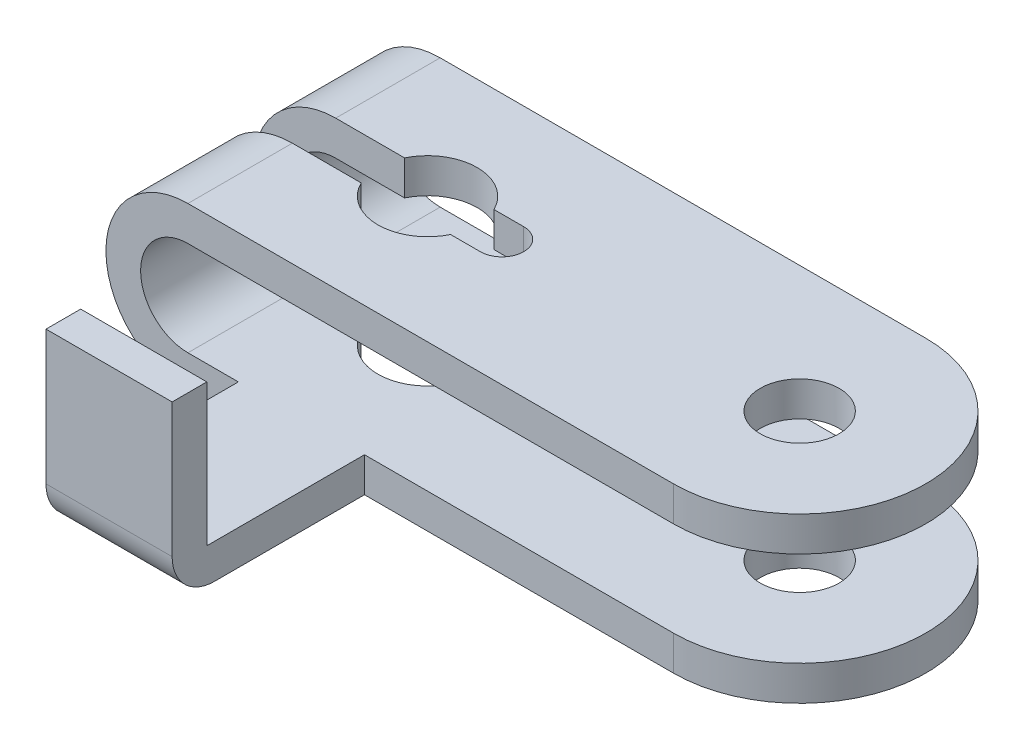
ISO-10303-21;
HEADER;
FILE_DESCRIPTION(('STEP AP214'),'2;1');
FILE_NAME('part.step','',(''),(''),'','','');
FILE_SCHEMA(('AUTOMOTIVE_DESIGN { 1 0 10303 214 1 1 1 1 }'));
ENDSEC;
DATA;
#1=APPLICATION_CONTEXT('core data for automotive mechanical design processes');
#2=APPLICATION_PROTOCOL_DEFINITION('international standard','automotive_design',2000,#1);
#3=PRODUCT_CONTEXT('',#1,'mechanical');
#4=PRODUCT('Part','Part','',(#3));
#5=PRODUCT_RELATED_PRODUCT_CATEGORY('part','',(#4));
#6=PRODUCT_DEFINITION_FORMATION('','',#4);
#7=PRODUCT_DEFINITION_CONTEXT('part definition',#1,'design');
#8=PRODUCT_DEFINITION('design','',#6,#7);
#9=PRODUCT_DEFINITION_SHAPE('','',#8);
#10=(LENGTH_UNIT() NAMED_UNIT(*) SI_UNIT(.MILLI.,.METRE.));
#11=(NAMED_UNIT(*) PLANE_ANGLE_UNIT() SI_UNIT($,.RADIAN.));
#12=(NAMED_UNIT(*) SI_UNIT($,.STERADIAN.) SOLID_ANGLE_UNIT());
#13=UNCERTAINTY_MEASURE_WITH_UNIT(LENGTH_MEASURE(1.E-05),#10,'distance_accuracy_value','');
#14=(GEOMETRIC_REPRESENTATION_CONTEXT(3) GLOBAL_UNCERTAINTY_ASSIGNED_CONTEXT((#13)) GLOBAL_UNIT_ASSIGNED_CONTEXT((#10,
#11,#12)) REPRESENTATION_CONTEXT('',''));
#15=CARTESIAN_POINT('',(0.,0.,0.));
#16=DIRECTION('',(0.,0.,1.));
#17=DIRECTION('',(1.,0.,0.));
#18=AXIS2_PLACEMENT_3D('',#15,#16,#17);
#19=CARTESIAN_POINT('',(0.,-8.2,16.));
#20=DIRECTION('',(0.,-1.,0.));
#21=DIRECTION('',(0.,0.,-1.));
#22=AXIS2_PLACEMENT_3D('',#19,#20,#21);
#23=PLANE('',#22);
#24=CARTESIAN_POINT('',(30.8,-8.2,8.));
#25=DIRECTION('',(0.,-1.,0.));
#26=DIRECTION('',(0.,0.,-1.));
#27=AXIS2_PLACEMENT_3D('',#24,#25,#26);
#28=CIRCLE('',#27,2.5);
#29=CARTESIAN_POINT('',(30.8,-8.2,5.5));
#30=VERTEX_POINT('',#29);
#31=EDGE_CURVE('E419',#30,#30,#28,.T.);
#32=ORIENTED_EDGE('',*,*,#31,.T.);
#33=EDGE_LOOP('',(#32));
#34=FACE_BOUND('',#33,.T.);
#35=DIRECTION('',(-1.,0.,0.));
#36=VECTOR('',#35,1.);
#37=CARTESIAN_POINT('',(3.19999999999999,-8.2,26.));
#38=LINE('',#37,#36);
#39=CARTESIAN_POINT('',(11.2,-8.2,26.));
#40=VERTEX_POINT('',#39);
#41=CARTESIAN_POINT('',(3.19999999999999,-8.2,26.));
#42=VERTEX_POINT('',#41);
#43=EDGE_CURVE('E314',#40,#42,#38,.T.);
#44=ORIENTED_EDGE('',*,*,#43,.F.);
#45=DIRECTION('',(0.,0.,-1.));
#46=VECTOR('',#45,1.);
#47=CARTESIAN_POINT('',(11.2,-8.2,28.2));
#48=LINE('',#47,#46);
#49=CARTESIAN_POINT('',(11.2,-8.2,16.));
#50=VERTEX_POINT('',#49);
#51=EDGE_CURVE('E334',#40,#50,#48,.T.);
#52=ORIENTED_EDGE('',*,*,#51,.T.);
#53=DIRECTION('',(-1.,0.,0.));
#54=VECTOR('',#53,1.);
#55=CARTESIAN_POINT('',(0.,-8.2,16.));
#56=LINE('',#55,#54);
#57=CARTESIAN_POINT('',(30.8,-8.2,16.));
#58=VERTEX_POINT('',#57);
#59=EDGE_CURVE('E477',#58,#50,#56,.T.);
#60=ORIENTED_EDGE('',*,*,#59,.F.);
#61=CARTESIAN_POINT('',(30.8,-8.2,8.));
#62=DIRECTION('',(0.,-1.,0.));
#63=DIRECTION('',(0.,0.,-1.));
#64=AXIS2_PLACEMENT_3D('',#61,#62,#63);
#65=CIRCLE('',#64,8.);
#66=CARTESIAN_POINT('',(30.8,-8.2,0.));
#67=VERTEX_POINT('',#66);
#68=EDGE_CURVE('E414',#58,#67,#65,.F.);
#69=ORIENTED_EDGE('',*,*,#68,.T.);
#70=DIRECTION('',(-1.,0.,0.));
#71=VECTOR('',#70,1.);
#72=CARTESIAN_POINT('',(0.,-8.2,0.));
#73=LINE('',#72,#71);
#74=CARTESIAN_POINT('',(0.,-8.2,0.));
#75=VERTEX_POINT('',#74);
#76=EDGE_CURVE('E493',#67,#75,#73,.T.);
#77=ORIENTED_EDGE('',*,*,#76,.T.);
#78=DIRECTION('',(0.,0.,-1.));
#79=VECTOR('',#78,1.);
#80=CARTESIAN_POINT('',(0.,-8.2,16.));
#81=LINE('',#80,#79);
#82=CARTESIAN_POINT('',(0.,-8.2,6.625));
#83=VERTEX_POINT('',#82);
#84=EDGE_CURVE('E509',#83,#75,#81,.T.);
#85=ORIENTED_EDGE('',*,*,#84,.F.);
#86=DIRECTION('',(-1.,0.,0.));
#87=VECTOR('',#86,1.);
#88=CARTESIAN_POINT('',(0.,-8.2,6.625));
#89=LINE('',#88,#87);
#90=CARTESIAN_POINT('',(4.36594371968375,-8.2,6.625));
#91=VERTEX_POINT('',#90);
#92=EDGE_CURVE('E463',#91,#83,#89,.T.);
#93=ORIENTED_EDGE('',*,*,#92,.F.);
#94=CARTESIAN_POINT('',(7.2,-8.2,8.));
#95=DIRECTION('',(0.,-1.,0.));
#96=DIRECTION('',(0.,0.,-1.));
#97=AXIS2_PLACEMENT_3D('',#94,#95,#96);
#98=CIRCLE('',#97,3.15);
#99=CARTESIAN_POINT('',(10.0340562803162,-8.2,6.62499999999999));
#100=VERTEX_POINT('',#99);
#101=EDGE_CURVE('E456',#91,#100,#98,.T.);
#102=ORIENTED_EDGE('',*,*,#101,.T.);
#103=DIRECTION('',(-1.,0.,0.));
#104=VECTOR('',#103,1.);
#105=CARTESIAN_POINT('',(0.,-8.2,6.625));
#106=LINE('',#105,#104);
#107=CARTESIAN_POINT('',(11.925,-8.2,6.62499999999999));
#108=VERTEX_POINT('',#107);
#109=EDGE_CURVE('E451',#108,#100,#106,.T.);
#110=ORIENTED_EDGE('',*,*,#109,.F.);
#111=CARTESIAN_POINT('',(11.925,-8.2,8.));
#112=DIRECTION('',(0.,-1.,0.));
#113=DIRECTION('',(0.,0.,-1.));
#114=AXIS2_PLACEMENT_3D('',#111,#112,#113);
#115=CIRCLE('',#114,1.37500000000001);
#116=CARTESIAN_POINT('',(11.925,-8.2,9.37500000000001));
#117=VERTEX_POINT('',#116);
#118=EDGE_CURVE('E447',#117,#108,#115,.F.);
#119=ORIENTED_EDGE('',*,*,#118,.F.);
#120=DIRECTION('',(-1.,0.,0.));
#121=VECTOR('',#120,1.);
#122=CARTESIAN_POINT('',(0.,-8.2,9.375));
#123=LINE('',#122,#121);
#124=CARTESIAN_POINT('',(10.0340562803162,-8.2,9.375));
#125=VERTEX_POINT('',#124);
#126=EDGE_CURVE('E442',#117,#125,#123,.T.);
#127=ORIENTED_EDGE('',*,*,#126,.T.);
#128=CARTESIAN_POINT('',(7.2,-8.2,8.));
#129=DIRECTION('',(0.,-1.,0.));
#130=DIRECTION('',(0.,0.,-1.));
#131=AXIS2_PLACEMENT_3D('',#128,#129,#130);
#132=CIRCLE('',#131,3.15);
#133=CARTESIAN_POINT('',(4.36594371968375,-8.2,9.375));
#134=VERTEX_POINT('',#133);
#135=EDGE_CURVE('E436',#125,#134,#132,.T.);
#136=ORIENTED_EDGE('',*,*,#135,.T.);
#137=DIRECTION('',(-1.,0.,0.));
#138=VECTOR('',#137,1.);
#139=CARTESIAN_POINT('',(0.,-8.2,9.375));
#140=LINE('',#139,#138);
#141=CARTESIAN_POINT('',(0.,-8.2,9.375));
#142=VERTEX_POINT('',#141);
#143=EDGE_CURVE('E428',#134,#142,#140,.T.);
#144=ORIENTED_EDGE('',*,*,#143,.T.);
#145=CARTESIAN_POINT('',(0.,-8.2,16.));
#146=VERTEX_POINT('',#145);
#147=EDGE_CURVE('E510',#146,#142,#81,.T.);
#148=ORIENTED_EDGE('',*,*,#147,.F.);
#149=CARTESIAN_POINT('',(3.2,-8.2,16.));
#150=VERTEX_POINT('',#149);
#151=EDGE_CURVE('E476',#150,#146,#56,.T.);
#152=ORIENTED_EDGE('',*,*,#151,.F.);
#153=DIRECTION('',(0.,0.,-1.));
#154=VECTOR('',#153,1.);
#155=CARTESIAN_POINT('',(3.2,-8.2,28.2));
#156=LINE('',#155,#154);
#157=EDGE_CURVE('E332',#42,#150,#156,.T.);
#158=ORIENTED_EDGE('',*,*,#157,.F.);
#159=EDGE_LOOP('',(#44,#52,#60,#69,#77,#85,#93,#102,#110,#119,#127,#136,#144,#148,#152,#158));
#160=FACE_BOUND('',#159,.T.);
#161=ADVANCED_FACE('F89',(#34,#160),#23,.F.);
#162=CARTESIAN_POINT('',(0.,-5.2,16.));
#163=DIRECTION('',(0.,0.,1.));
#164=DIRECTION('',(1.,0.,0.));
#165=AXIS2_PLACEMENT_3D('',#162,#163,#164);
#166=PLANE('',#165);
#167=DIRECTION('',(1.,0.,0.));
#168=VECTOR('',#167,1.);
#169=CARTESIAN_POINT('',(0.,-10.4,16.));
#170=LINE('',#169,#168);
#171=CARTESIAN_POINT('',(0.,-10.4,16.));
#172=VERTEX_POINT('',#171);
#173=CARTESIAN_POINT('',(3.2,-10.4,16.));
#174=VERTEX_POINT('',#173);
#175=EDGE_CURVE('E473',#172,#174,#170,.T.);
#176=ORIENTED_EDGE('',*,*,#175,.T.);
#177=DIRECTION('',(0.,-1.,0.));
#178=VECTOR('',#177,1.);
#179=CARTESIAN_POINT('',(3.2,0.,16.));
#180=LINE('',#179,#178);
#181=EDGE_CURVE('E325',#150,#174,#180,.T.);
#182=ORIENTED_EDGE('',*,*,#181,.F.);
#183=ORIENTED_EDGE('',*,*,#151,.T.);
#184=CARTESIAN_POINT('',(0.,-5.2,16.));
#185=DIRECTION('',(0.,0.,-1.));
#186=DIRECTION('',(1.,0.,0.));
#187=AXIS2_PLACEMENT_3D('',#184,#185,#186);
#188=CIRCLE('',#187,3.);
#189=CARTESIAN_POINT('',(0.,-2.2,16.));
#190=VERTEX_POINT('',#189);
#191=EDGE_CURVE('E480',#146,#190,#188,.T.);
#192=ORIENTED_EDGE('',*,*,#191,.T.);
#193=DIRECTION('',(1.,0.,0.));
#194=VECTOR('',#193,1.);
#195=CARTESIAN_POINT('',(0.,-2.2,16.));
#196=LINE('',#195,#194);
#197=CARTESIAN_POINT('',(30.8,-2.2,16.));
#198=VERTEX_POINT('',#197);
#199=EDGE_CURVE('E482',#190,#198,#196,.T.);
#200=ORIENTED_EDGE('',*,*,#199,.T.);
#201=DIRECTION('',(0.,1.,0.));
#202=VECTOR('',#201,1.);
#203=CARTESIAN_POINT('',(30.8,-29.9432852918848,16.));
#204=LINE('',#203,#202);
#205=CARTESIAN_POINT('',(30.8,0.,16.));
#206=VERTEX_POINT('',#205);
#207=EDGE_CURVE('E517',#206,#198,#204,.F.);
#208=ORIENTED_EDGE('',*,*,#207,.F.);
#209=DIRECTION('',(-1.,0.,0.));
#210=VECTOR('',#209,1.);
#211=CARTESIAN_POINT('',(0.,0.,16.));
#212=LINE('',#211,#210);
#213=CARTESIAN_POINT('',(0.,0.,16.));
#214=VERTEX_POINT('',#213);
#215=EDGE_CURVE('E485',#206,#214,#212,.T.);
#216=ORIENTED_EDGE('',*,*,#215,.T.);
#217=CARTESIAN_POINT('',(0.,-5.2,16.));
#218=DIRECTION('',(0.,0.,1.));
#219=DIRECTION('',(1.,0.,0.));
#220=AXIS2_PLACEMENT_3D('',#217,#218,#219);
#221=CIRCLE('',#220,5.2);
#222=EDGE_CURVE('E468',#214,#172,#221,.T.);
#223=ORIENTED_EDGE('',*,*,#222,.T.);
#224=EDGE_LOOP('',(#176,#182,#183,#192,#200,#208,#216,#223));
#225=FACE_BOUND('',#224,.T.);
#226=ADVANCED_FACE('F544',(#225),#166,.T.);
#227=CARTESIAN_POINT('',(0.,-10.4,16.));
#228=DIRECTION('',(0.,1.,0.));
#229=DIRECTION('',(0.,0.,1.));
#230=AXIS2_PLACEMENT_3D('',#227,#228,#229);
#231=PLANE('',#230);
#232=CARTESIAN_POINT('',(30.8,-10.4,8.));
#233=DIRECTION('',(0.,1.,0.));
#234=DIRECTION('',(0.,0.,1.));
#235=AXIS2_PLACEMENT_3D('',#232,#233,#234);
#236=CIRCLE('',#235,2.5);
#237=CARTESIAN_POINT('',(30.8,-10.4,10.5));
#238=VERTEX_POINT('',#237);
#239=EDGE_CURVE('E407',#238,#238,#236,.F.);
#240=ORIENTED_EDGE('',*,*,#239,.F.);
#241=EDGE_LOOP('',(#240));
#242=FACE_BOUND('',#241,.T.);
#243=DIRECTION('',(0.,0.,-1.));
#244=VECTOR('',#243,1.);
#245=CARTESIAN_POINT('',(11.2,-10.4,28.2));
#246=LINE('',#245,#244);
#247=CARTESIAN_POINT('',(11.2,-10.4,25.5));
#248=VERTEX_POINT('',#247);
#249=CARTESIAN_POINT('',(11.2,-10.4,16.));
#250=VERTEX_POINT('',#249);
#251=EDGE_CURVE('E336',#248,#250,#246,.T.);
#252=ORIENTED_EDGE('',*,*,#251,.F.);
#253=DIRECTION('',(1.,0.,0.));
#254=VECTOR('',#253,1.);
#255=CARTESIAN_POINT('',(3.2,-10.4,25.5));
#256=LINE('',#255,#254);
#257=CARTESIAN_POINT('',(3.2,-10.4,25.5));
#258=VERTEX_POINT('',#257);
#259=EDGE_CURVE('E97',#248,#258,#256,.F.);
#260=ORIENTED_EDGE('',*,*,#259,.T.);
#261=DIRECTION('',(0.,0.,-1.));
#262=VECTOR('',#261,1.);
#263=CARTESIAN_POINT('',(3.2,-10.4,28.2));
#264=LINE('',#263,#262);
#265=EDGE_CURVE('E300',#258,#174,#264,.T.);
#266=ORIENTED_EDGE('',*,*,#265,.T.);
#267=ORIENTED_EDGE('',*,*,#175,.F.);
#268=DIRECTION('',(0.,0.,-1.));
#269=VECTOR('',#268,1.);
#270=CARTESIAN_POINT('',(0.,-10.4,16.));
#271=LINE('',#270,#269);
#272=CARTESIAN_POINT('',(0.,-10.4,9.375));
#273=VERTEX_POINT('',#272);
#274=EDGE_CURVE('E514',#172,#273,#271,.T.);
#275=ORIENTED_EDGE('',*,*,#274,.T.);
#276=DIRECTION('',(-1.,0.,0.));
#277=VECTOR('',#276,1.);
#278=CARTESIAN_POINT('',(0.,-10.4,9.375));
#279=LINE('',#278,#277);
#280=CARTESIAN_POINT('',(4.36594371968375,-10.4,9.375));
#281=VERTEX_POINT('',#280);
#282=EDGE_CURVE('E358',#281,#273,#279,.T.);
#283=ORIENTED_EDGE('',*,*,#282,.F.);
#284=CARTESIAN_POINT('',(7.2,-10.4,8.));
#285=DIRECTION('',(0.,1.,0.));
#286=DIRECTION('',(0.,0.,1.));
#287=AXIS2_PLACEMENT_3D('',#284,#285,#286);
#288=CIRCLE('',#287,3.15);
#289=CARTESIAN_POINT('',(10.0340562803163,-10.4,9.375));
#290=VERTEX_POINT('',#289);
#291=EDGE_CURVE('E342',#290,#281,#288,.F.);
#292=ORIENTED_EDGE('',*,*,#291,.F.);
#293=DIRECTION('',(-1.,0.,0.));
#294=VECTOR('',#293,1.);
#295=CARTESIAN_POINT('',(0.,-10.4,9.375));
#296=LINE('',#295,#294);
#297=CARTESIAN_POINT('',(11.925,-10.4,9.37500000000001));
#298=VERTEX_POINT('',#297);
#299=EDGE_CURVE('E344',#298,#290,#296,.T.);
#300=ORIENTED_EDGE('',*,*,#299,.F.);
#301=CARTESIAN_POINT('',(11.925,-10.4,8.));
#302=DIRECTION('',(0.,1.,0.));
#303=DIRECTION('',(0.,0.,1.));
#304=AXIS2_PLACEMENT_3D('',#301,#302,#303);
#305=CIRCLE('',#304,1.37500000000001);
#306=CARTESIAN_POINT('',(11.925,-10.4,6.62499999999999));
#307=VERTEX_POINT('',#306);
#308=EDGE_CURVE('E347',#298,#307,#305,.T.);
#309=ORIENTED_EDGE('',*,*,#308,.T.);
#310=DIRECTION('',(-1.,0.,0.));
#311=VECTOR('',#310,1.);
#312=CARTESIAN_POINT('',(0.,-10.4,6.625));
#313=LINE('',#312,#311);
#314=CARTESIAN_POINT('',(10.0340562803162,-10.4,6.62499999999999));
#315=VERTEX_POINT('',#314);
#316=EDGE_CURVE('E350',#307,#315,#313,.T.);
#317=ORIENTED_EDGE('',*,*,#316,.T.);
#318=CARTESIAN_POINT('',(7.2,-10.4,8.));
#319=DIRECTION('',(0.,1.,0.));
#320=DIRECTION('',(0.,0.,1.));
#321=AXIS2_PLACEMENT_3D('',#318,#319,#320);
#322=CIRCLE('',#321,3.15);
#323=CARTESIAN_POINT('',(4.36594371968375,-10.4,6.625));
#324=VERTEX_POINT('',#323);
#325=EDGE_CURVE('E353',#324,#315,#322,.F.);
#326=ORIENTED_EDGE('',*,*,#325,.F.);
#327=DIRECTION('',(-1.,0.,0.));
#328=VECTOR('',#327,1.);
#329=CARTESIAN_POINT('',(0.,-10.4,6.625));
#330=LINE('',#329,#328);
#331=CARTESIAN_POINT('',(0.,-10.4,6.625));
#332=VERTEX_POINT('',#331);
#333=EDGE_CURVE('E355',#324,#332,#330,.T.);
#334=ORIENTED_EDGE('',*,*,#333,.T.);
#335=CARTESIAN_POINT('',(0.,-10.4,0.));
#336=VERTEX_POINT('',#335);
#337=EDGE_CURVE('E513',#332,#336,#271,.T.);
#338=ORIENTED_EDGE('',*,*,#337,.T.);
#339=DIRECTION('',(1.,0.,0.));
#340=VECTOR('',#339,1.);
#341=CARTESIAN_POINT('',(0.,-10.4,0.));
#342=LINE('',#341,#340);
#343=CARTESIAN_POINT('',(30.8,-10.4,0.));
#344=VERTEX_POINT('',#343);
#345=EDGE_CURVE('E490',#336,#344,#342,.T.);
#346=ORIENTED_EDGE('',*,*,#345,.T.);
#347=CARTESIAN_POINT('',(30.8,-10.4,8.));
#348=DIRECTION('',(0.,1.,0.));
#349=DIRECTION('',(0.,0.,1.));
#350=AXIS2_PLACEMENT_3D('',#347,#348,#349);
#351=CIRCLE('',#350,8.);
#352=CARTESIAN_POINT('',(30.8,-10.4,16.));
#353=VERTEX_POINT('',#352);
#354=EDGE_CURVE('E341',#353,#344,#351,.T.);
#355=ORIENTED_EDGE('',*,*,#354,.F.);
#356=EDGE_CURVE('E471',#250,#353,#170,.T.);
#357=ORIENTED_EDGE('',*,*,#356,.F.);
#358=EDGE_LOOP('',(#252,#260,#266,#267,#275,#283,#292,#300,#309,#317,#326,#334,#338,#346,#355,#357));
#359=FACE_BOUND('',#358,.T.);
#360=ADVANCED_FACE('F557',(#242,#359),#231,.F.);
#361=CARTESIAN_POINT('',(0.,-2.2,16.));
#362=DIRECTION('',(0.,1.,0.));
#363=DIRECTION('',(0.,0.,1.));
#364=AXIS2_PLACEMENT_3D('',#361,#362,#363);
#365=PLANE('',#364);
#366=CARTESIAN_POINT('',(30.8,-2.2,8.));
#367=DIRECTION('',(0.,1.,0.));
#368=DIRECTION('',(0.,0.,1.));
#369=AXIS2_PLACEMENT_3D('',#366,#367,#368);
#370=CIRCLE('',#369,2.5);
#371=CARTESIAN_POINT('',(30.8,-2.2,10.5));
#372=VERTEX_POINT('',#371);
#373=EDGE_CURVE('E416',#372,#372,#370,.T.);
#374=ORIENTED_EDGE('',*,*,#373,.T.);
#375=EDGE_LOOP('',(#374));
#376=FACE_BOUND('',#375,.T.);
#377=DIRECTION('',(1.,0.,0.));
#378=VECTOR('',#377,1.);
#379=CARTESIAN_POINT('',(0.,-2.2,0.));
#380=LINE('',#379,#378);
#381=CARTESIAN_POINT('',(0.,-2.2,0.));
#382=VERTEX_POINT('',#381);
#383=CARTESIAN_POINT('',(30.8,-2.2,0.));
#384=VERTEX_POINT('',#383);
#385=EDGE_CURVE('E498',#382,#384,#380,.T.);
#386=ORIENTED_EDGE('',*,*,#385,.T.);
#387=CARTESIAN_POINT('',(30.8,-2.2,8.));
#388=DIRECTION('',(0.,1.,0.));
#389=DIRECTION('',(0.,0.,1.));
#390=AXIS2_PLACEMENT_3D('',#387,#388,#389);
#391=CIRCLE('',#390,8.);
#392=EDGE_CURVE('E400',#384,#198,#391,.F.);
#393=ORIENTED_EDGE('',*,*,#392,.T.);
#394=ORIENTED_EDGE('',*,*,#199,.F.);
#395=DIRECTION('',(0.,0.,-1.));
#396=VECTOR('',#395,1.);
#397=CARTESIAN_POINT('',(0.,-2.2,16.));
#398=LINE('',#397,#396);
#399=CARTESIAN_POINT('',(0.,-2.2,9.375));
#400=VERTEX_POINT('',#399);
#401=EDGE_CURVE('E506',#190,#400,#398,.T.);
#402=ORIENTED_EDGE('',*,*,#401,.T.);
#403=DIRECTION('',(1.,0.,0.));
#404=VECTOR('',#403,1.);
#405=CARTESIAN_POINT('',(0.,-2.2,9.375));
#406=LINE('',#405,#404);
#407=CARTESIAN_POINT('',(4.36594371968375,-2.2,9.375));
#408=VERTEX_POINT('',#407);
#409=EDGE_CURVE('E422',#400,#408,#406,.T.);
#410=ORIENTED_EDGE('',*,*,#409,.T.);
#411=CARTESIAN_POINT('',(7.2,-2.2,8.));
#412=DIRECTION('',(0.,1.,0.));
#413=DIRECTION('',(0.,0.,1.));
#414=AXIS2_PLACEMENT_3D('',#411,#412,#413);
#415=CIRCLE('',#414,3.15);
#416=CARTESIAN_POINT('',(10.0340562803162,-2.2,9.375));
#417=VERTEX_POINT('',#416);
#418=EDGE_CURVE('E433',#408,#417,#415,.T.);
#419=ORIENTED_EDGE('',*,*,#418,.T.);
#420=DIRECTION('',(1.,0.,0.));
#421=VECTOR('',#420,1.);
#422=CARTESIAN_POINT('',(0.,-2.2,9.375));
#423=LINE('',#422,#421);
#424=CARTESIAN_POINT('',(11.925,-2.2,9.37500000000001));
#425=VERTEX_POINT('',#424);
#426=EDGE_CURVE('E439',#417,#425,#423,.T.);
#427=ORIENTED_EDGE('',*,*,#426,.T.);
#428=CARTESIAN_POINT('',(11.925,-2.2,8.));
#429=DIRECTION('',(0.,1.,0.));
#430=DIRECTION('',(0.,0.,1.));
#431=AXIS2_PLACEMENT_3D('',#428,#429,#430);
#432=CIRCLE('',#431,1.37500000000001);
#433=CARTESIAN_POINT('',(11.925,-2.2,6.62499999999999));
#434=VERTEX_POINT('',#433);
#435=EDGE_CURVE('E445',#434,#425,#432,.F.);
#436=ORIENTED_EDGE('',*,*,#435,.F.);
#437=DIRECTION('',(1.,0.,0.));
#438=VECTOR('',#437,1.);
#439=CARTESIAN_POINT('',(0.,-2.2,6.625));
#440=LINE('',#439,#438);
#441=CARTESIAN_POINT('',(10.0340562803162,-2.2,6.62499999999999));
#442=VERTEX_POINT('',#441);
#443=EDGE_CURVE('E449',#442,#434,#440,.T.);
#444=ORIENTED_EDGE('',*,*,#443,.F.);
#445=CARTESIAN_POINT('',(7.2,-2.2,8.));
#446=DIRECTION('',(0.,1.,0.));
#447=DIRECTION('',(0.,0.,1.));
#448=AXIS2_PLACEMENT_3D('',#445,#446,#447);
#449=CIRCLE('',#448,3.15);
#450=CARTESIAN_POINT('',(4.36594371968375,-2.2,6.625));
#451=VERTEX_POINT('',#450);
#452=EDGE_CURVE('E453',#442,#451,#449,.T.);
#453=ORIENTED_EDGE('',*,*,#452,.T.);
#454=DIRECTION('',(1.,0.,0.));
#455=VECTOR('',#454,1.);
#456=CARTESIAN_POINT('',(0.,-2.2,6.625));
#457=LINE('',#456,#455);
#458=CARTESIAN_POINT('',(0.,-2.2,6.625));
#459=VERTEX_POINT('',#458);
#460=EDGE_CURVE('E459',#459,#451,#457,.T.);
#461=ORIENTED_EDGE('',*,*,#460,.F.);
#462=EDGE_CURVE('E505',#459,#382,#398,.T.);
#463=ORIENTED_EDGE('',*,*,#462,.T.);
#464=EDGE_LOOP('',(#386,#393,#394,#402,#410,#419,#427,#436,#444,#453,#461,#463));
#465=FACE_BOUND('',#464,.T.);
#466=ADVANCED_FACE('F565',(#376,#465),#365,.F.);
#467=CARTESIAN_POINT('',(0.,0.,16.));
#468=DIRECTION('',(0.,-1.,0.));
#469=DIRECTION('',(1.,0.,0.));
#470=AXIS2_PLACEMENT_3D('',#467,#468,#469);
#471=PLANE('',#470);
#472=CARTESIAN_POINT('',(30.8,0.,8.));
#473=DIRECTION('',(0.,1.,0.));
#474=DIRECTION('',(-1.,0.,0.));
#475=AXIS2_PLACEMENT_3D('',#472,#473,#474);
#476=CIRCLE('',#475,2.5);
#477=CARTESIAN_POINT('',(28.3,0.,8.));
#478=VERTEX_POINT('',#477);
#479=EDGE_CURVE('E363',#478,#478,#476,.T.);
#480=ORIENTED_EDGE('',*,*,#479,.F.);
#481=EDGE_LOOP('',(#480));
#482=FACE_BOUND('',#481,.T.);
#483=CARTESIAN_POINT('',(30.8,0.,8.));
#484=DIRECTION('',(0.,1.,0.));
#485=DIRECTION('',(-1.,0.,0.));
#486=AXIS2_PLACEMENT_3D('',#483,#484,#485);
#487=CIRCLE('',#486,8.);
#488=CARTESIAN_POINT('',(30.8,0.,0.));
#489=VERTEX_POINT('',#488);
#490=EDGE_CURVE('E405',#489,#206,#487,.F.);
#491=ORIENTED_EDGE('',*,*,#490,.F.);
#492=DIRECTION('',(-1.,0.,0.));
#493=VECTOR('',#492,1.);
#494=CARTESIAN_POINT('',(0.,0.,0.));
#495=LINE('',#494,#493);
#496=CARTESIAN_POINT('',(0.,0.,0.));
#497=VERTEX_POINT('',#496);
#498=EDGE_CURVE('E472',#489,#497,#495,.T.);
#499=ORIENTED_EDGE('',*,*,#498,.T.);
#500=DIRECTION('',(0.,0.,-1.));
#501=VECTOR('',#500,1.);
#502=CARTESIAN_POINT('',(0.,0.,16.));
#503=LINE('',#502,#501);
#504=CARTESIAN_POINT('',(0.,0.,6.625));
#505=VERTEX_POINT('',#504);
#506=EDGE_CURVE('E487',#505,#497,#503,.T.);
#507=ORIENTED_EDGE('',*,*,#506,.F.);
#508=DIRECTION('',(-1.,0.,0.));
#509=VECTOR('',#508,1.);
#510=CARTESIAN_POINT('',(0.,0.,6.625));
#511=LINE('',#510,#509);
#512=CARTESIAN_POINT('',(4.36594371968375,0.,6.625));
#513=VERTEX_POINT('',#512);
#514=EDGE_CURVE('E522',#513,#505,#511,.T.);
#515=ORIENTED_EDGE('',*,*,#514,.F.);
#516=CARTESIAN_POINT('',(7.2,0.,8.));
#517=DIRECTION('',(0.,1.,0.));
#518=DIRECTION('',(-1.,0.,0.));
#519=AXIS2_PLACEMENT_3D('',#516,#517,#518);
#520=CIRCLE('',#519,3.15);
#521=CARTESIAN_POINT('',(10.0340562803162,0.,6.62499999999999));
#522=VERTEX_POINT('',#521);
#523=EDGE_CURVE('E372',#522,#513,#520,.T.);
#524=ORIENTED_EDGE('',*,*,#523,.F.);
#525=DIRECTION('',(1.,0.,0.));
#526=VECTOR('',#525,1.);
#527=CARTESIAN_POINT('',(0.,0.,6.625));
#528=LINE('',#527,#526);
#529=CARTESIAN_POINT('',(11.925,0.,6.62499999999999));
#530=VERTEX_POINT('',#529);
#531=EDGE_CURVE('E369',#522,#530,#528,.T.);
#532=ORIENTED_EDGE('',*,*,#531,.T.);
#533=CARTESIAN_POINT('',(11.925,0.,8.));
#534=DIRECTION('',(0.,1.,0.));
#535=DIRECTION('',(-1.,0.,0.));
#536=AXIS2_PLACEMENT_3D('',#533,#534,#535);
#537=CIRCLE('',#536,1.37500000000001);
#538=CARTESIAN_POINT('',(11.925,0.,9.37500000000001));
#539=VERTEX_POINT('',#538);
#540=EDGE_CURVE('E366',#530,#539,#537,.F.);
#541=ORIENTED_EDGE('',*,*,#540,.T.);
#542=DIRECTION('',(1.,0.,0.));
#543=VECTOR('',#542,1.);
#544=CARTESIAN_POINT('',(0.,0.,9.375));
#545=LINE('',#544,#543);
#546=CARTESIAN_POINT('',(10.0340562803162,0.,9.375));
#547=VERTEX_POINT('',#546);
#548=EDGE_CURVE('E362',#547,#539,#545,.T.);
#549=ORIENTED_EDGE('',*,*,#548,.F.);
#550=CARTESIAN_POINT('',(7.2,0.,8.));
#551=DIRECTION('',(0.,1.,0.));
#552=DIRECTION('',(-1.,0.,0.));
#553=AXIS2_PLACEMENT_3D('',#550,#551,#552);
#554=CIRCLE('',#553,3.15);
#555=CARTESIAN_POINT('',(4.36594371968375,0.,9.375));
#556=VERTEX_POINT('',#555);
#557=EDGE_CURVE('E359',#556,#547,#554,.T.);
#558=ORIENTED_EDGE('',*,*,#557,.F.);
#559=DIRECTION('',(-1.,0.,0.));
#560=VECTOR('',#559,1.);
#561=CARTESIAN_POINT('',(0.,0.,9.375));
#562=LINE('',#561,#560);
#563=CARTESIAN_POINT('',(0.,0.,9.375));
#564=VERTEX_POINT('',#563);
#565=EDGE_CURVE('E519',#556,#564,#562,.T.);
#566=ORIENTED_EDGE('',*,*,#565,.T.);
#567=EDGE_CURVE('E502',#214,#564,#503,.T.);
#568=ORIENTED_EDGE('',*,*,#567,.F.);
#569=ORIENTED_EDGE('',*,*,#215,.F.);
#570=EDGE_LOOP('',(#491,#499,#507,#515,#524,#532,#541,#549,#558,#566,#568,#569));
#571=FACE_BOUND('',#570,.T.);
#572=ADVANCED_FACE('F579',(#482,#571),#471,.F.);
#573=CARTESIAN_POINT('',(0.,-5.2,16.));
#574=DIRECTION('',(0.,0.,-1.));
#575=DIRECTION('',(-1.,0.,0.));
#576=AXIS2_PLACEMENT_3D('',#573,#574,#575);
#577=CYLINDRICAL_SURFACE('',#576,5.2);
#578=CARTESIAN_POINT('',(0.,-5.2,6.625));
#579=DIRECTION('',(0.,0.,1.));
#580=DIRECTION('',(1.,0.,0.));
#581=AXIS2_PLACEMENT_3D('',#578,#579,#580);
#582=CIRCLE('',#581,5.2);
#583=EDGE_CURVE('E465',#505,#332,#582,.T.);
#584=ORIENTED_EDGE('',*,*,#583,.F.);
#585=ORIENTED_EDGE('',*,*,#506,.T.);
#586=CARTESIAN_POINT('',(0.,-5.2,0.));
#587=DIRECTION('',(0.,0.,1.));
#588=DIRECTION('',(1.,0.,0.));
#589=AXIS2_PLACEMENT_3D('',#586,#587,#588);
#590=CIRCLE('',#589,5.2);
#591=EDGE_CURVE('E467',#497,#336,#590,.T.);
#592=ORIENTED_EDGE('',*,*,#591,.T.);
#593=ORIENTED_EDGE('',*,*,#337,.F.);
#594=EDGE_LOOP('',(#584,#585,#592,#593));
#595=FACE_BOUND('',#594,.T.);
#596=ADVANCED_FACE('F571',(#595),#577,.T.);
#597=CARTESIAN_POINT('',(0.,-5.2,16.));
#598=DIRECTION('',(0.,0.,-1.));
#599=DIRECTION('',(-1.,0.,0.));
#600=AXIS2_PLACEMENT_3D('',#597,#598,#599);
#601=CYLINDRICAL_SURFACE('',#600,3.);
#602=CARTESIAN_POINT('',(0.,-5.2,6.625));
#603=DIRECTION('',(0.,0.,1.));
#604=DIRECTION('',(1.,0.,0.));
#605=AXIS2_PLACEMENT_3D('',#602,#603,#604);
#606=CIRCLE('',#605,3.);
#607=EDGE_CURVE('E461',#83,#459,#606,.F.);
#608=ORIENTED_EDGE('',*,*,#607,.F.);
#609=ORIENTED_EDGE('',*,*,#84,.T.);
#610=CARTESIAN_POINT('',(0.,-5.2,0.));
#611=DIRECTION('',(0.,0.,-1.));
#612=DIRECTION('',(1.,0.,0.));
#613=AXIS2_PLACEMENT_3D('',#610,#611,#612);
#614=CIRCLE('',#613,3.);
#615=EDGE_CURVE('E495',#75,#382,#614,.T.);
#616=ORIENTED_EDGE('',*,*,#615,.T.);
#617=ORIENTED_EDGE('',*,*,#462,.F.);
#618=EDGE_LOOP('',(#608,#609,#616,#617));
#619=FACE_BOUND('',#618,.T.);
#620=ADVANCED_FACE('F569',(#619),#601,.F.);
#621=ORIENTED_EDGE('',*,*,#567,.T.);
#622=CARTESIAN_POINT('',(0.,-5.2,9.375));
#623=DIRECTION('',(0.,0.,1.));
#624=DIRECTION('',(1.,0.,0.));
#625=AXIS2_PLACEMENT_3D('',#622,#623,#624);
#626=CIRCLE('',#625,5.2);
#627=EDGE_CURVE('E431',#564,#273,#626,.T.);
#628=ORIENTED_EDGE('',*,*,#627,.T.);
#629=ORIENTED_EDGE('',*,*,#274,.F.);
#630=ORIENTED_EDGE('',*,*,#222,.F.);
#631=EDGE_LOOP('',(#621,#628,#629,#630));
#632=FACE_BOUND('',#631,.T.);
#633=ADVANCED_FACE('F567',(#632),#577,.T.);
#634=ORIENTED_EDGE('',*,*,#147,.T.);
#635=CARTESIAN_POINT('',(0.,-5.2,9.375));
#636=DIRECTION('',(0.,0.,1.));
#637=DIRECTION('',(1.,0.,0.));
#638=AXIS2_PLACEMENT_3D('',#635,#636,#637);
#639=CIRCLE('',#638,3.);
#640=EDGE_CURVE('E425',#142,#400,#639,.F.);
#641=ORIENTED_EDGE('',*,*,#640,.T.);
#642=ORIENTED_EDGE('',*,*,#401,.F.);
#643=ORIENTED_EDGE('',*,*,#191,.F.);
#644=EDGE_LOOP('',(#634,#641,#642,#643));
#645=FACE_BOUND('',#644,.T.);
#646=ADVANCED_FACE('F562',(#645),#601,.F.);
#647=DIRECTION('',(0.,-1.,0.));
#648=VECTOR('',#647,1.);
#649=CARTESIAN_POINT('',(11.2,0.,16.));
#650=LINE('',#649,#648);
#651=EDGE_CURVE('E324',#50,#250,#650,.T.);
#652=ORIENTED_EDGE('',*,*,#651,.T.);
#653=ORIENTED_EDGE('',*,*,#356,.T.);
#654=DIRECTION('',(0.,1.,0.));
#655=VECTOR('',#654,1.);
#656=CARTESIAN_POINT('',(30.8,-29.9432852918848,16.));
#657=LINE('',#656,#655);
#658=EDGE_CURVE('E402',#353,#58,#657,.T.);
#659=ORIENTED_EDGE('',*,*,#658,.T.);
#660=ORIENTED_EDGE('',*,*,#59,.T.);
#661=EDGE_LOOP('',(#652,#653,#659,#660));
#662=FACE_BOUND('',#661,.T.);
#663=ADVANCED_FACE('F559',(#662),#166,.T.);
#664=CARTESIAN_POINT('',(0.,-5.2,0.));
#665=DIRECTION('',(0.,0.,1.));
#666=DIRECTION('',(1.,0.,0.));
#667=AXIS2_PLACEMENT_3D('',#664,#665,#666);
#668=PLANE('',#667);
#669=ORIENTED_EDGE('',*,*,#498,.F.);
#670=DIRECTION('',(0.,1.,0.));
#671=VECTOR('',#670,1.);
#672=CARTESIAN_POINT('',(30.8,-29.9432852918848,0.));
#673=LINE('',#672,#671);
#674=EDGE_CURVE('E524',#489,#384,#673,.F.);
#675=ORIENTED_EDGE('',*,*,#674,.T.);
#676=ORIENTED_EDGE('',*,*,#385,.F.);
#677=ORIENTED_EDGE('',*,*,#615,.F.);
#678=ORIENTED_EDGE('',*,*,#76,.F.);
#679=DIRECTION('',(0.,1.,0.));
#680=VECTOR('',#679,1.);
#681=CARTESIAN_POINT('',(30.8,-29.9432852918848,0.));
#682=LINE('',#681,#680);
#683=EDGE_CURVE('E338',#344,#67,#682,.T.);
#684=ORIENTED_EDGE('',*,*,#683,.F.);
#685=ORIENTED_EDGE('',*,*,#345,.F.);
#686=ORIENTED_EDGE('',*,*,#591,.F.);
#687=EDGE_LOOP('',(#669,#675,#676,#677,#678,#684,#685,#686));
#688=FACE_BOUND('',#687,.T.);
#689=ADVANCED_FACE('F599',(#688),#668,.F.);
#690=CARTESIAN_POINT('',(30.8,-29.9432852918848,8.));
#691=DIRECTION('',(0.,1.,0.));
#692=DIRECTION('',(-1.,0.,0.));
#693=AXIS2_PLACEMENT_3D('',#690,#691,#692);
#694=CYLINDRICAL_SURFACE('',#693,8.);
#695=ORIENTED_EDGE('',*,*,#658,.F.);
#696=ORIENTED_EDGE('',*,*,#354,.T.);
#697=ORIENTED_EDGE('',*,*,#683,.T.);
#698=ORIENTED_EDGE('',*,*,#68,.F.);
#699=EDGE_LOOP('',(#695,#696,#697,#698));
#700=FACE_BOUND('',#699,.T.);
#701=ADVANCED_FACE('F687',(#700),#694,.T.);
#702=ORIENTED_EDGE('',*,*,#392,.F.);
#703=ORIENTED_EDGE('',*,*,#674,.F.);
#704=ORIENTED_EDGE('',*,*,#490,.T.);
#705=ORIENTED_EDGE('',*,*,#207,.T.);
#706=EDGE_LOOP('',(#702,#703,#704,#705));
#707=FACE_BOUND('',#706,.T.);
#708=ADVANCED_FACE('F655',(#707),#694,.T.);
#709=CARTESIAN_POINT('',(30.8,-29.9432852918848,8.));
#710=DIRECTION('',(0.,1.,0.));
#711=DIRECTION('',(-1.,0.,0.));
#712=AXIS2_PLACEMENT_3D('',#709,#710,#711);
#713=CYLINDRICAL_SURFACE('',#712,2.5);
#714=ORIENTED_EDGE('',*,*,#479,.T.);
#715=EDGE_LOOP('',(#714));
#716=FACE_BOUND('',#715,.T.);
#717=ORIENTED_EDGE('',*,*,#373,.F.);
#718=EDGE_LOOP('',(#717));
#719=FACE_BOUND('',#718,.T.);
#720=ADVANCED_FACE('F693',(#716,#719),#713,.F.);
#721=CARTESIAN_POINT('',(0.,-29.9432852918848,6.625));
#722=DIRECTION('',(0.,0.,1.));
#723=DIRECTION('',(1.,0.,0.));
#724=AXIS2_PLACEMENT_3D('',#721,#722,#723);
#725=PLANE('',#724);
#726=ORIENTED_EDGE('',*,*,#583,.T.);
#727=ORIENTED_EDGE('',*,*,#333,.F.);
#728=DIRECTION('',(0.,1.,0.));
#729=VECTOR('',#728,1.);
#730=CARTESIAN_POINT('',(4.36594371968375,-29.9432852918848,6.625));
#731=LINE('',#730,#729);
#732=EDGE_CURVE('E345',#324,#91,#731,.T.);
#733=ORIENTED_EDGE('',*,*,#732,.T.);
#734=ORIENTED_EDGE('',*,*,#92,.T.);
#735=ORIENTED_EDGE('',*,*,#607,.T.);
#736=ORIENTED_EDGE('',*,*,#460,.T.);
#737=EDGE_CURVE('E378',#451,#513,#731,.T.);
#738=ORIENTED_EDGE('',*,*,#737,.T.);
#739=ORIENTED_EDGE('',*,*,#514,.T.);
#740=EDGE_LOOP('',(#726,#727,#733,#734,#735,#736,#738,#739));
#741=FACE_BOUND('',#740,.T.);
#742=ADVANCED_FACE('F608',(#741),#725,.T.);
#743=CARTESIAN_POINT('',(7.2,-29.9432852918848,8.));
#744=DIRECTION('',(0.,1.,0.));
#745=DIRECTION('',(-1.,0.,0.));
#746=AXIS2_PLACEMENT_3D('',#743,#744,#745);
#747=CYLINDRICAL_SURFACE('',#746,3.15);
#748=ORIENTED_EDGE('',*,*,#732,.F.);
#749=ORIENTED_EDGE('',*,*,#325,.T.);
#750=DIRECTION('',(0.,1.,0.));
#751=VECTOR('',#750,1.);
#752=CARTESIAN_POINT('',(10.0340562803162,-29.9432852918848,6.62499999999999));
#753=LINE('',#752,#751);
#754=EDGE_CURVE('E379',#315,#100,#753,.T.);
#755=ORIENTED_EDGE('',*,*,#754,.T.);
#756=ORIENTED_EDGE('',*,*,#101,.F.);
#757=EDGE_LOOP('',(#748,#749,#755,#756));
#758=FACE_BOUND('',#757,.T.);
#759=ADVANCED_FACE('F611',(#758),#747,.F.);
#760=EDGE_CURVE('E382',#442,#522,#753,.T.);
#761=ORIENTED_EDGE('',*,*,#760,.T.);
#762=ORIENTED_EDGE('',*,*,#523,.T.);
#763=ORIENTED_EDGE('',*,*,#737,.F.);
#764=ORIENTED_EDGE('',*,*,#452,.F.);
#765=EDGE_LOOP('',(#761,#762,#763,#764));
#766=FACE_BOUND('',#765,.T.);
#767=ADVANCED_FACE('F625',(#766),#747,.F.);
#768=CARTESIAN_POINT('',(0.,-29.9432852918848,6.625));
#769=DIRECTION('',(0.,0.,1.));
#770=DIRECTION('',(1.,0.,0.));
#771=AXIS2_PLACEMENT_3D('',#768,#769,#770);
#772=PLANE('',#771);
#773=ORIENTED_EDGE('',*,*,#109,.T.);
#774=ORIENTED_EDGE('',*,*,#754,.F.);
#775=ORIENTED_EDGE('',*,*,#316,.F.);
#776=DIRECTION('',(0.,1.,0.));
#777=VECTOR('',#776,1.);
#778=CARTESIAN_POINT('',(11.925,-29.9432852918848,6.62499999999999));
#779=LINE('',#778,#777);
#780=EDGE_CURVE('E383',#307,#108,#779,.T.);
#781=ORIENTED_EDGE('',*,*,#780,.T.);
#782=EDGE_LOOP('',(#773,#774,#775,#781));
#783=FACE_BOUND('',#782,.T.);
#784=ADVANCED_FACE('F668',(#783),#772,.T.);
#785=ORIENTED_EDGE('',*,*,#443,.T.);
#786=EDGE_CURVE('E386',#434,#530,#779,.T.);
#787=ORIENTED_EDGE('',*,*,#786,.T.);
#788=ORIENTED_EDGE('',*,*,#531,.F.);
#789=ORIENTED_EDGE('',*,*,#760,.F.);
#790=EDGE_LOOP('',(#785,#787,#788,#789));
#791=FACE_BOUND('',#790,.T.);
#792=ADVANCED_FACE('F631',(#791),#772,.T.);
#793=CARTESIAN_POINT('',(11.925,-29.9432852918848,8.));
#794=DIRECTION('',(0.,1.,0.));
#795=DIRECTION('',(-1.,0.,0.));
#796=AXIS2_PLACEMENT_3D('',#793,#794,#795);
#797=CYLINDRICAL_SURFACE('',#796,1.37500000000001);
#798=ORIENTED_EDGE('',*,*,#118,.T.);
#799=ORIENTED_EDGE('',*,*,#780,.F.);
#800=ORIENTED_EDGE('',*,*,#308,.F.);
#801=DIRECTION('',(0.,1.,0.));
#802=VECTOR('',#801,1.);
#803=CARTESIAN_POINT('',(11.925,-29.9432852918848,9.37500000000001));
#804=LINE('',#803,#802);
#805=EDGE_CURVE('E387',#298,#117,#804,.T.);
#806=ORIENTED_EDGE('',*,*,#805,.T.);
#807=EDGE_LOOP('',(#798,#799,#800,#806));
#808=FACE_BOUND('',#807,.T.);
#809=ADVANCED_FACE('F666',(#808),#797,.F.);
#810=ORIENTED_EDGE('',*,*,#435,.T.);
#811=EDGE_CURVE('E390',#425,#539,#804,.T.);
#812=ORIENTED_EDGE('',*,*,#811,.T.);
#813=ORIENTED_EDGE('',*,*,#540,.F.);
#814=ORIENTED_EDGE('',*,*,#786,.F.);
#815=EDGE_LOOP('',(#810,#812,#813,#814));
#816=FACE_BOUND('',#815,.T.);
#817=ADVANCED_FACE('F635',(#816),#797,.F.);
#818=CARTESIAN_POINT('',(0.,-29.9432852918848,9.375));
#819=DIRECTION('',(0.,0.,1.));
#820=DIRECTION('',(1.,0.,0.));
#821=AXIS2_PLACEMENT_3D('',#818,#819,#820);
#822=PLANE('',#821);
#823=ORIENTED_EDGE('',*,*,#805,.F.);
#824=ORIENTED_EDGE('',*,*,#299,.T.);
#825=DIRECTION('',(0.,1.,0.));
#826=VECTOR('',#825,1.);
#827=CARTESIAN_POINT('',(10.0340562803163,-29.9432852918848,9.375));
#828=LINE('',#827,#826);
#829=EDGE_CURVE('E391',#290,#125,#828,.T.);
#830=ORIENTED_EDGE('',*,*,#829,.T.);
#831=ORIENTED_EDGE('',*,*,#126,.F.);
#832=EDGE_LOOP('',(#823,#824,#830,#831));
#833=FACE_BOUND('',#832,.T.);
#834=ADVANCED_FACE('F662',(#833),#822,.F.);
#835=EDGE_CURVE('E394',#417,#547,#828,.T.);
#836=ORIENTED_EDGE('',*,*,#835,.T.);
#837=ORIENTED_EDGE('',*,*,#548,.T.);
#838=ORIENTED_EDGE('',*,*,#811,.F.);
#839=ORIENTED_EDGE('',*,*,#426,.F.);
#840=EDGE_LOOP('',(#836,#837,#838,#839));
#841=FACE_BOUND('',#840,.T.);
#842=ADVANCED_FACE('F638',(#841),#822,.F.);
#843=CARTESIAN_POINT('',(7.2,-29.9432852918848,8.));
#844=DIRECTION('',(0.,1.,0.));
#845=DIRECTION('',(-1.,0.,0.));
#846=AXIS2_PLACEMENT_3D('',#843,#844,#845);
#847=CYLINDRICAL_SURFACE('',#846,3.15);
#848=ORIENTED_EDGE('',*,*,#829,.F.);
#849=ORIENTED_EDGE('',*,*,#291,.T.);
#850=DIRECTION('',(0.,1.,0.));
#851=VECTOR('',#850,1.);
#852=CARTESIAN_POINT('',(4.36594371968375,-29.9432852918848,9.375));
#853=LINE('',#852,#851);
#854=EDGE_CURVE('E395',#281,#134,#853,.T.);
#855=ORIENTED_EDGE('',*,*,#854,.T.);
#856=ORIENTED_EDGE('',*,*,#135,.F.);
#857=EDGE_LOOP('',(#848,#849,#855,#856));
#858=FACE_BOUND('',#857,.T.);
#859=ADVANCED_FACE('F658',(#858),#847,.F.);
#860=EDGE_CURVE('E375',#408,#556,#853,.T.);
#861=ORIENTED_EDGE('',*,*,#860,.T.);
#862=ORIENTED_EDGE('',*,*,#557,.T.);
#863=ORIENTED_EDGE('',*,*,#835,.F.);
#864=ORIENTED_EDGE('',*,*,#418,.F.);
#865=EDGE_LOOP('',(#861,#862,#863,#864));
#866=FACE_BOUND('',#865,.T.);
#867=ADVANCED_FACE('F644',(#866),#847,.F.);
#868=CARTESIAN_POINT('',(0.,-29.9432852918848,9.375));
#869=DIRECTION('',(0.,0.,1.));
#870=DIRECTION('',(1.,0.,0.));
#871=AXIS2_PLACEMENT_3D('',#868,#869,#870);
#872=PLANE('',#871);
#873=ORIENTED_EDGE('',*,*,#565,.F.);
#874=ORIENTED_EDGE('',*,*,#860,.F.);
#875=ORIENTED_EDGE('',*,*,#409,.F.);
#876=ORIENTED_EDGE('',*,*,#640,.F.);
#877=ORIENTED_EDGE('',*,*,#143,.F.);
#878=ORIENTED_EDGE('',*,*,#854,.F.);
#879=ORIENTED_EDGE('',*,*,#282,.T.);
#880=ORIENTED_EDGE('',*,*,#627,.F.);
#881=EDGE_LOOP('',(#873,#874,#875,#876,#877,#878,#879,#880));
#882=FACE_BOUND('',#881,.T.);
#883=ADVANCED_FACE('F647',(#882),#872,.F.);
#884=ORIENTED_EDGE('',*,*,#239,.T.);
#885=EDGE_LOOP('',(#884));
#886=FACE_BOUND('',#885,.T.);
#887=ORIENTED_EDGE('',*,*,#31,.F.);
#888=EDGE_LOOP('',(#887));
#889=FACE_BOUND('',#888,.T.);
#890=ADVANCED_FACE('F686',(#886,#889),#713,.F.);
#891=CARTESIAN_POINT('',(11.2,0.,28.2));
#892=DIRECTION('',(1.,0.,0.));
#893=DIRECTION('',(0.,0.,-1.));
#894=AXIS2_PLACEMENT_3D('',#891,#892,#893);
#895=PLANE('',#894);
#896=DIRECTION('',(0.,-1.,0.));
#897=VECTOR('',#896,1.);
#898=CARTESIAN_POINT('',(11.2,0.,28.2));
#899=LINE('',#898,#897);
#900=CARTESIAN_POINT('',(11.2,0.8,28.2));
#901=VERTEX_POINT('',#900);
#902=CARTESIAN_POINT('',(11.2,-7.7,28.2));
#903=VERTEX_POINT('',#902);
#904=EDGE_CURVE('E301',#901,#903,#899,.T.);
#905=ORIENTED_EDGE('',*,*,#904,.T.);
#906=CARTESIAN_POINT('',(11.2,-7.7,25.5));
#907=DIRECTION('',(1.,0.,0.));
#908=DIRECTION('',(0.,0.,-1.));
#909=AXIS2_PLACEMENT_3D('',#906,#907,#908);
#910=CIRCLE('',#909,2.7);
#911=EDGE_CURVE('E111',#903,#248,#910,.T.);
#912=ORIENTED_EDGE('',*,*,#911,.T.);
#913=ORIENTED_EDGE('',*,*,#251,.T.);
#914=ORIENTED_EDGE('',*,*,#651,.F.);
#915=ORIENTED_EDGE('',*,*,#51,.F.);
#916=DIRECTION('',(0.,-1.,0.));
#917=VECTOR('',#916,1.);
#918=CARTESIAN_POINT('',(11.2,0.8,26.));
#919=LINE('',#918,#917);
#920=CARTESIAN_POINT('',(11.2,0.8,26.));
#921=VERTEX_POINT('',#920);
#922=EDGE_CURVE('E322',#921,#40,#919,.T.);
#923=ORIENTED_EDGE('',*,*,#922,.F.);
#924=DIRECTION('',(0.,0.,-1.));
#925=VECTOR('',#924,1.);
#926=CARTESIAN_POINT('',(11.2,0.8,28.2));
#927=LINE('',#926,#925);
#928=EDGE_CURVE('E308',#901,#921,#927,.T.);
#929=ORIENTED_EDGE('',*,*,#928,.F.);
#930=EDGE_LOOP('',(#905,#912,#913,#914,#915,#923,#929));
#931=FACE_BOUND('',#930,.T.);
#932=ADVANCED_FACE('F530',(#931),#895,.T.);
#933=CARTESIAN_POINT('',(3.2,0.,28.2));
#934=DIRECTION('',(1.,0.,0.));
#935=DIRECTION('',(0.,1.,0.));
#936=AXIS2_PLACEMENT_3D('',#933,#934,#935);
#937=PLANE('',#936);
#938=ORIENTED_EDGE('',*,*,#265,.F.);
#939=CARTESIAN_POINT('',(3.2,-7.7,25.5));
#940=DIRECTION('',(1.,0.,0.));
#941=DIRECTION('',(0.,1.,0.));
#942=AXIS2_PLACEMENT_3D('',#939,#940,#941);
#943=CIRCLE('',#942,2.7);
#944=CARTESIAN_POINT('',(3.2,-7.7,28.2));
#945=VERTEX_POINT('',#944);
#946=EDGE_CURVE('E14',#258,#945,#943,.F.);
#947=ORIENTED_EDGE('',*,*,#946,.T.);
#948=DIRECTION('',(0.,-1.,0.));
#949=VECTOR('',#948,1.);
#950=CARTESIAN_POINT('',(3.2,0.,28.2));
#951=LINE('',#950,#949);
#952=CARTESIAN_POINT('',(3.19999999999999,0.8,28.2));
#953=VERTEX_POINT('',#952);
#954=EDGE_CURVE('E290',#953,#945,#951,.T.);
#955=ORIENTED_EDGE('',*,*,#954,.F.);
#956=DIRECTION('',(0.,0.,1.));
#957=VECTOR('',#956,1.);
#958=CARTESIAN_POINT('',(3.19999999999999,0.8,28.2));
#959=LINE('',#958,#957);
#960=CARTESIAN_POINT('',(3.19999999999999,0.8,26.));
#961=VERTEX_POINT('',#960);
#962=EDGE_CURVE('E295',#961,#953,#959,.T.);
#963=ORIENTED_EDGE('',*,*,#962,.F.);
#964=DIRECTION('',(0.,-1.,0.));
#965=VECTOR('',#964,1.);
#966=CARTESIAN_POINT('',(3.19999999999999,0.8,26.));
#967=LINE('',#966,#965);
#968=EDGE_CURVE('E319',#961,#42,#967,.T.);
#969=ORIENTED_EDGE('',*,*,#968,.T.);
#970=ORIENTED_EDGE('',*,*,#157,.T.);
#971=ORIENTED_EDGE('',*,*,#181,.T.);
#972=EDGE_LOOP('',(#938,#947,#955,#963,#969,#970,#971));
#973=FACE_BOUND('',#972,.T.);
#974=ADVANCED_FACE('F292',(#973),#937,.F.);
#975=CARTESIAN_POINT('',(0.,0.,28.2));
#976=DIRECTION('',(0.,0.,1.));
#977=DIRECTION('',(1.,0.,0.));
#978=AXIS2_PLACEMENT_3D('',#975,#976,#977);
#979=PLANE('',#978);
#980=ORIENTED_EDGE('',*,*,#954,.T.);
#981=DIRECTION('',(1.,0.,0.));
#982=VECTOR('',#981,1.);
#983=CARTESIAN_POINT('',(11.2,-7.7,28.2));
#984=LINE('',#983,#982);
#985=EDGE_CURVE('E527',#945,#903,#984,.T.);
#986=ORIENTED_EDGE('',*,*,#985,.T.);
#987=ORIENTED_EDGE('',*,*,#904,.F.);
#988=DIRECTION('',(1.,0.,0.));
#989=VECTOR('',#988,1.);
#990=CARTESIAN_POINT('',(3.19999999999999,0.8,28.2));
#991=LINE('',#990,#989);
#992=EDGE_CURVE('E304',#953,#901,#991,.T.);
#993=ORIENTED_EDGE('',*,*,#992,.F.);
#994=EDGE_LOOP('',(#980,#986,#987,#993));
#995=FACE_BOUND('',#994,.T.);
#996=ADVANCED_FACE('F305',(#995),#979,.T.);
#997=CARTESIAN_POINT('',(3.19999999999999,0.8,26.));
#998=DIRECTION('',(0.,0.,1.));
#999=DIRECTION('',(1.,0.,0.));
#1000=AXIS2_PLACEMENT_3D('',#997,#998,#999);
#1001=PLANE('',#1000);
#1002=ORIENTED_EDGE('',*,*,#43,.T.);
#1003=ORIENTED_EDGE('',*,*,#968,.F.);
#1004=DIRECTION('',(-1.,0.,0.));
#1005=VECTOR('',#1004,1.);
#1006=CARTESIAN_POINT('',(3.19999999999999,0.8,26.));
#1007=LINE('',#1006,#1005);
#1008=EDGE_CURVE('E312',#921,#961,#1007,.T.);
#1009=ORIENTED_EDGE('',*,*,#1008,.F.);
#1010=ORIENTED_EDGE('',*,*,#922,.T.);
#1011=EDGE_LOOP('',(#1002,#1003,#1009,#1010));
#1012=FACE_BOUND('',#1011,.T.);
#1013=ADVANCED_FACE('F536',(#1012),#1001,.F.);
#1014=CARTESIAN_POINT('',(0.,0.8,0.));
#1015=DIRECTION('',(0.,-1.,0.));
#1016=DIRECTION('',(0.,0.,-1.));
#1017=AXIS2_PLACEMENT_3D('',#1014,#1015,#1016);
#1018=PLANE('',#1017);
#1019=ORIENTED_EDGE('',*,*,#962,.T.);
#1020=ORIENTED_EDGE('',*,*,#992,.T.);
#1021=ORIENTED_EDGE('',*,*,#928,.T.);
#1022=ORIENTED_EDGE('',*,*,#1008,.T.);
#1023=EDGE_LOOP('',(#1019,#1020,#1021,#1022));
#1024=FACE_BOUND('',#1023,.T.);
#1025=ADVANCED_FACE('F310',(#1024),#1018,.F.);
#1026=CARTESIAN_POINT('',(0.,-7.7,25.5));
#1027=DIRECTION('',(-1.,0.,0.));
#1028=DIRECTION('',(0.,0.,1.));
#1029=AXIS2_PLACEMENT_3D('',#1026,#1027,#1028);
#1030=CYLINDRICAL_SURFACE('',#1029,2.7);
#1031=ORIENTED_EDGE('',*,*,#946,.F.);
#1032=ORIENTED_EDGE('',*,*,#259,.F.);
#1033=ORIENTED_EDGE('',*,*,#911,.F.);
#1034=ORIENTED_EDGE('',*,*,#985,.F.);
#1035=EDGE_LOOP('',(#1031,#1032,#1033,#1034));
#1036=FACE_BOUND('',#1035,.T.);
#1037=ADVANCED_FACE('F91',(#1036),#1030,.T.);
#1038=CLOSED_SHELL('',(#161,#226,#360,#466,#572,#596,#620,#633,#646,#663,#689,#701,#708,#720,
#742,#759,#767,#784,#792,#809,#817,#834,#842,#859,#867,#883,#890,#932,#974,#996,#1013,#1025,#1037));
#1039=MANIFOLD_SOLID_BREP('B2',#1038);
#1040=ADVANCED_BREP_SHAPE_REPRESENTATION('',(#18,#1039),#14);
#1041=SHAPE_DEFINITION_REPRESENTATION(#9,#1040);
ENDSEC;
END-ISO-10303-21;
